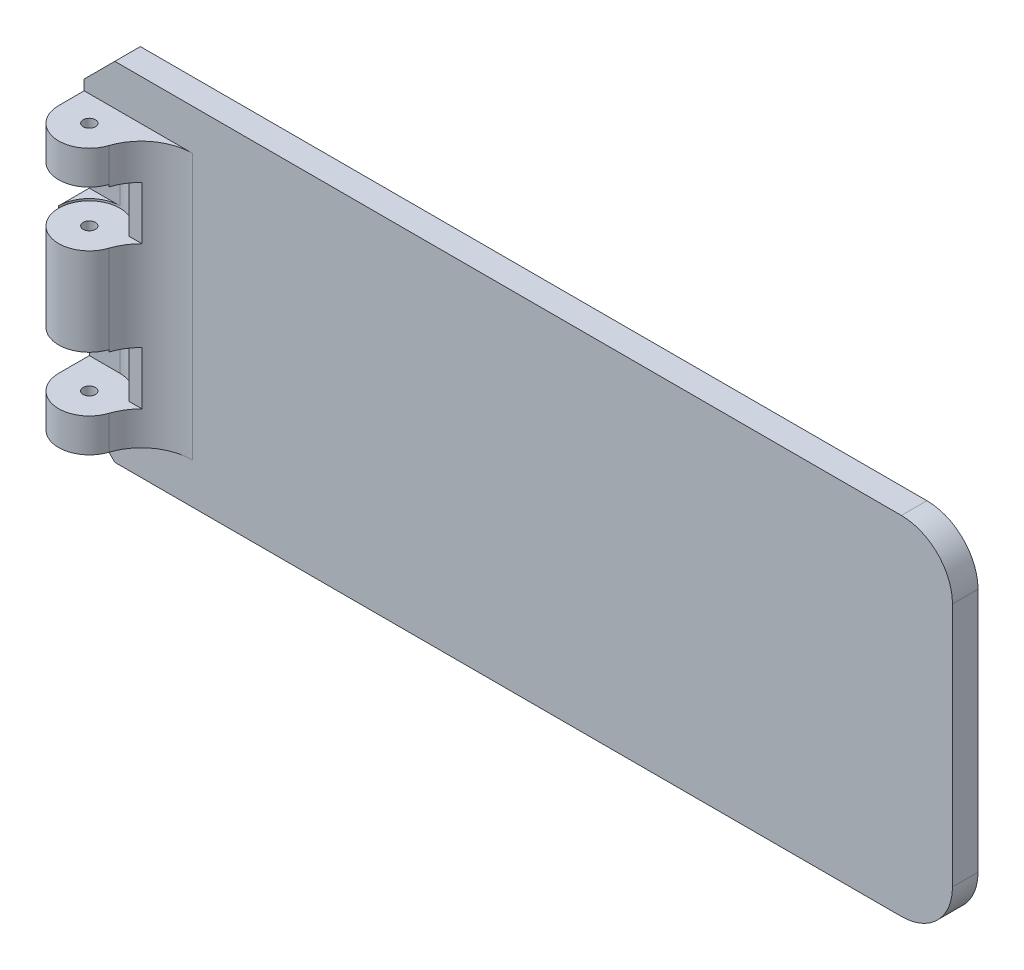
ISO-10303-21;
HEADER;
FILE_DESCRIPTION(('STEP AP214'),'2;1');
FILE_NAME('part.step','',(''),(''),'','','');
FILE_SCHEMA(('AUTOMOTIVE_DESIGN { 1 0 10303 214 1 1 1 1 }'));
ENDSEC;
DATA;
#1=APPLICATION_CONTEXT('core data for automotive mechanical design processes');
#2=APPLICATION_PROTOCOL_DEFINITION('international standard','automotive_design',2000,#1);
#3=PRODUCT_CONTEXT('',#1,'mechanical');
#4=PRODUCT('Part','Part','',(#3));
#5=PRODUCT_RELATED_PRODUCT_CATEGORY('part','',(#4));
#6=PRODUCT_DEFINITION_FORMATION('','',#4);
#7=PRODUCT_DEFINITION_CONTEXT('part definition',#1,'design');
#8=PRODUCT_DEFINITION('design','',#6,#7);
#9=PRODUCT_DEFINITION_SHAPE('','',#8);
#10=(LENGTH_UNIT() NAMED_UNIT(*) SI_UNIT(.MILLI.,.METRE.));
#11=(NAMED_UNIT(*) PLANE_ANGLE_UNIT() SI_UNIT($,.RADIAN.));
#12=(NAMED_UNIT(*) SI_UNIT($,.STERADIAN.) SOLID_ANGLE_UNIT());
#13=UNCERTAINTY_MEASURE_WITH_UNIT(LENGTH_MEASURE(1.E-05),#10,'distance_accuracy_value','');
#14=(GEOMETRIC_REPRESENTATION_CONTEXT(3) GLOBAL_UNCERTAINTY_ASSIGNED_CONTEXT((#13)) GLOBAL_UNIT_ASSIGNED_CONTEXT((#10,
#11,#12)) REPRESENTATION_CONTEXT('',''));
#15=CARTESIAN_POINT('',(0.,0.,0.));
#16=DIRECTION('',(0.,0.,1.));
#17=DIRECTION('',(1.,0.,0.));
#18=AXIS2_PLACEMENT_3D('',#15,#16,#17);
#19=CARTESIAN_POINT('',(3.,34.,5.));
#20=DIRECTION('',(0.,-1.,0.));
#21=DIRECTION('',(0.,0.,-1.));
#22=AXIS2_PLACEMENT_3D('',#19,#20,#21);
#23=CYLINDRICAL_SURFACE('',#22,3.);
#24=CARTESIAN_POINT('',(3.,4.,5.));
#25=DIRECTION('',(0.,-1.,0.));
#26=DIRECTION('',(0.,0.,-1.));
#27=AXIS2_PLACEMENT_3D('',#24,#25,#26);
#28=CIRCLE('',#27,3.);
#29=CARTESIAN_POINT('',(5.8497532787945,4.,5.9375));
#30=VERTEX_POINT('',#29);
#31=CARTESIAN_POINT('',(0.,4.,5.));
#32=VERTEX_POINT('',#31);
#33=EDGE_CURVE('E359',#30,#32,#28,.T.);
#34=ORIENTED_EDGE('',*,*,#33,.F.);
#35=DIRECTION('',(0.,-1.,0.));
#36=VECTOR('',#35,1.);
#37=CARTESIAN_POINT('',(5.8497532787945,34.,5.9375));
#38=LINE('',#37,#36);
#39=CARTESIAN_POINT('',(5.8497532787945,7.3,5.9375));
#40=VERTEX_POINT('',#39);
#41=EDGE_CURVE('E284',#30,#40,#38,.F.);
#42=ORIENTED_EDGE('',*,*,#41,.T.);
#43=CARTESIAN_POINT('',(3.,7.3,5.));
#44=DIRECTION('',(0.,1.,0.));
#45=DIRECTION('',(-1.,0.,0.));
#46=AXIS2_PLACEMENT_3D('',#43,#44,#45);
#47=CIRCLE('',#46,3.);
#48=CARTESIAN_POINT('',(0.,7.3,5.));
#49=VERTEX_POINT('',#48);
#50=EDGE_CURVE('E384',#49,#40,#47,.T.);
#51=ORIENTED_EDGE('',*,*,#50,.F.);
#52=DIRECTION('',(0.,-1.,0.));
#53=VECTOR('',#52,1.);
#54=CARTESIAN_POINT('',(0.,34.,5.));
#55=LINE('',#54,#53);
#56=EDGE_CURVE('E278',#49,#32,#55,.T.);
#57=ORIENTED_EDGE('',*,*,#56,.T.);
#58=EDGE_LOOP('',(#34,#42,#51,#57));
#59=FACE_BOUND('',#58,.T.);
#60=ADVANCED_FACE('F35',(#59),#23,.T.);
#61=CARTESIAN_POINT('',(3.,34.,5.));
#62=DIRECTION('',(0.,-1.,0.));
#63=DIRECTION('',(0.,0.,-1.));
#64=AXIS2_PLACEMENT_3D('',#61,#62,#63);
#65=CYLINDRICAL_SURFACE('',#64,0.6);
#66=CARTESIAN_POINT('',(3.,7.3,5.));
#67=DIRECTION('',(0.,1.,0.));
#68=DIRECTION('',(-1.,0.,0.));
#69=AXIS2_PLACEMENT_3D('',#66,#67,#68);
#70=CIRCLE('',#69,0.6);
#71=CARTESIAN_POINT('',(2.4,7.3,5.));
#72=VERTEX_POINT('',#71);
#73=EDGE_CURVE('E403',#72,#72,#70,.T.);
#74=ORIENTED_EDGE('',*,*,#73,.T.);
#75=EDGE_LOOP('',(#74));
#76=FACE_BOUND('',#75,.T.);
#77=CARTESIAN_POINT('',(3.,4.,5.));
#78=DIRECTION('',(0.,-1.,0.));
#79=DIRECTION('',(0.,0.,-1.));
#80=AXIS2_PLACEMENT_3D('',#77,#78,#79);
#81=CIRCLE('',#80,0.6);
#82=CARTESIAN_POINT('',(3.,4.,4.4));
#83=VERTEX_POINT('',#82);
#84=EDGE_CURVE('E364',#83,#83,#81,.T.);
#85=ORIENTED_EDGE('',*,*,#84,.T.);
#86=EDGE_LOOP('',(#85));
#87=FACE_BOUND('',#86,.T.);
#88=ADVANCED_FACE('F449',(#76,#87),#65,.F.);
#89=CARTESIAN_POINT('',(10.5993420767853,34.,7.5));
#90=DIRECTION('',(0.,-1.,0.));
#91=DIRECTION('',(0.,0.,-1.));
#92=AXIS2_PLACEMENT_3D('',#89,#90,#91);
#93=CYLINDRICAL_SURFACE('',#92,5.);
#94=CARTESIAN_POINT('',(5.8497532787945,26.5,5.9375));
#95=VERTEX_POINT('',#94);
#96=CARTESIAN_POINT('',(5.8497532787945,26.7,5.9375));
#97=VERTEX_POINT('',#96);
#98=EDGE_CURVE('E230',#95,#97,#38,.F.);
#99=ORIENTED_EDGE('',*,*,#98,.F.);
#100=CARTESIAN_POINT('',(10.5993420767853,26.5,7.5));
#101=DIRECTION('',(0.,1.,0.));
#102=DIRECTION('',(0.,0.,1.));
#103=AXIS2_PLACEMENT_3D('',#100,#101,#102);
#104=CIRCLE('',#103,5.);
#105=CARTESIAN_POINT('',(7.09098152661378,26.5,3.9375));
#106=VERTEX_POINT('',#105);
#107=EDGE_CURVE('E219',#95,#106,#104,.F.);
#108=ORIENTED_EDGE('',*,*,#107,.T.);
#109=DIRECTION('',(0.,-1.,0.));
#110=VECTOR('',#109,1.);
#111=CARTESIAN_POINT('',(7.09098152661378,34.,3.9375));
#112=LINE('',#111,#110);
#113=CARTESIAN_POINT('',(7.09098152661378,21.3,3.9375));
#114=VERTEX_POINT('',#113);
#115=EDGE_CURVE('E214',#106,#114,#112,.T.);
#116=ORIENTED_EDGE('',*,*,#115,.T.);
#117=CARTESIAN_POINT('',(10.5993420767853,21.3,7.5));
#118=DIRECTION('',(0.,-1.,0.));
#119=DIRECTION('',(0.,0.,-1.));
#120=AXIS2_PLACEMENT_3D('',#117,#118,#119);
#121=CIRCLE('',#120,5.);
#122=CARTESIAN_POINT('',(5.8497532787945,21.3,5.9375));
#123=VERTEX_POINT('',#122);
#124=EDGE_CURVE('E207',#114,#123,#121,.F.);
#125=ORIENTED_EDGE('',*,*,#124,.T.);
#126=CARTESIAN_POINT('',(5.8497532787945,12.7,5.9375));
#127=VERTEX_POINT('',#126);
#128=EDGE_CURVE('E212',#127,#123,#38,.F.);
#129=ORIENTED_EDGE('',*,*,#128,.F.);
#130=CARTESIAN_POINT('',(5.8497532787945,12.5,5.9375));
#131=VERTEX_POINT('',#130);
#132=EDGE_CURVE('E229',#131,#127,#38,.F.);
#133=ORIENTED_EDGE('',*,*,#132,.F.);
#134=CARTESIAN_POINT('',(10.5993420767853,12.5,7.5));
#135=DIRECTION('',(0.,1.,0.));
#136=DIRECTION('',(0.,0.,1.));
#137=AXIS2_PLACEMENT_3D('',#134,#135,#136);
#138=CIRCLE('',#137,5.);
#139=CARTESIAN_POINT('',(7.09098152661378,12.5,3.9375));
#140=VERTEX_POINT('',#139);
#141=EDGE_CURVE('E337',#131,#140,#138,.F.);
#142=ORIENTED_EDGE('',*,*,#141,.T.);
#143=DIRECTION('',(0.,-1.,0.));
#144=VECTOR('',#143,1.);
#145=CARTESIAN_POINT('',(7.09098152661378,34.,3.9375));
#146=LINE('',#145,#144);
#147=CARTESIAN_POINT('',(7.09098152661378,7.3,3.9375));
#148=VERTEX_POINT('',#147);
#149=EDGE_CURVE('E346',#140,#148,#146,.T.);
#150=ORIENTED_EDGE('',*,*,#149,.T.);
#151=CARTESIAN_POINT('',(10.5993420767853,7.3,7.5));
#152=DIRECTION('',(0.,-1.,0.));
#153=DIRECTION('',(0.,0.,-1.));
#154=AXIS2_PLACEMENT_3D('',#151,#152,#153);
#155=CIRCLE('',#154,5.);
#156=EDGE_CURVE('E349',#148,#40,#155,.F.);
#157=ORIENTED_EDGE('',*,*,#156,.T.);
#158=ORIENTED_EDGE('',*,*,#41,.F.);
#159=CARTESIAN_POINT('',(10.5993420767853,4.,7.5));
#160=DIRECTION('',(0.,-1.,0.));
#161=DIRECTION('',(0.,0.,-1.));
#162=AXIS2_PLACEMENT_3D('',#159,#160,#161);
#163=CIRCLE('',#162,5.);
#164=CARTESIAN_POINT('',(10.5993420767853,4.,2.5));
#165=VERTEX_POINT('',#164);
#166=EDGE_CURVE('E295',#165,#30,#163,.F.);
#167=ORIENTED_EDGE('',*,*,#166,.F.);
#168=DIRECTION('',(0.,1.,0.));
#169=VECTOR('',#168,1.);
#170=CARTESIAN_POINT('',(10.5993420767853,0.,2.5));
#171=LINE('',#170,#169);
#172=CARTESIAN_POINT('',(10.5993420767853,30.,2.5));
#173=VERTEX_POINT('',#172);
#174=EDGE_CURVE('E281',#173,#165,#171,.F.);
#175=ORIENTED_EDGE('',*,*,#174,.F.);
#176=CARTESIAN_POINT('',(10.5993420767853,30.,7.5));
#177=DIRECTION('',(0.,-1.,0.));
#178=DIRECTION('',(0.,0.,-1.));
#179=AXIS2_PLACEMENT_3D('',#176,#177,#178);
#180=CIRCLE('',#179,5.);
#181=CARTESIAN_POINT('',(5.8497532787945,30.,5.9375));
#182=VERTEX_POINT('',#181);
#183=EDGE_CURVE('E292',#173,#182,#180,.F.);
#184=ORIENTED_EDGE('',*,*,#183,.T.);
#185=EDGE_CURVE('E232',#97,#182,#38,.F.);
#186=ORIENTED_EDGE('',*,*,#185,.F.);
#187=EDGE_LOOP('',(#99,#108,#116,#125,#129,#133,#142,#150,#157,#158,#167,#175,#184,#186));
#188=FACE_BOUND('',#187,.T.);
#189=ADVANCED_FACE('F210',(#188),#93,.F.);
#190=CARTESIAN_POINT('',(0.,21.3,5.));
#191=VERTEX_POINT('',#190);
#192=CARTESIAN_POINT('',(0.,12.7,5.));
#193=VERTEX_POINT('',#192);
#194=EDGE_CURVE('E282',#191,#193,#55,.T.);
#195=ORIENTED_EDGE('',*,*,#194,.T.);
#196=CARTESIAN_POINT('',(3.,12.7,5.));
#197=DIRECTION('',(0.,1.,0.));
#198=DIRECTION('',(-1.,0.,0.));
#199=AXIS2_PLACEMENT_3D('',#196,#197,#198);
#200=CIRCLE('',#199,3.);
#201=EDGE_CURVE('E228',#193,#127,#200,.T.);
#202=ORIENTED_EDGE('',*,*,#201,.T.);
#203=ORIENTED_EDGE('',*,*,#128,.T.);
#204=CARTESIAN_POINT('',(3.,21.3,5.));
#205=DIRECTION('',(0.,1.,0.));
#206=DIRECTION('',(-1.,0.,0.));
#207=AXIS2_PLACEMENT_3D('',#204,#205,#206);
#208=CIRCLE('',#207,3.);
#209=EDGE_CURVE('E226',#191,#123,#208,.T.);
#210=ORIENTED_EDGE('',*,*,#209,.F.);
#211=EDGE_LOOP('',(#195,#202,#203,#210));
#212=FACE_BOUND('',#211,.T.);
#213=ADVANCED_FACE('F225',(#212),#23,.T.);
#214=CARTESIAN_POINT('',(3.,12.7,5.));
#215=DIRECTION('',(0.,1.,0.));
#216=DIRECTION('',(-1.,0.,0.));
#217=AXIS2_PLACEMENT_3D('',#214,#215,#216);
#218=CIRCLE('',#217,0.6);
#219=CARTESIAN_POINT('',(2.4,12.7,5.));
#220=VERTEX_POINT('',#219);
#221=EDGE_CURVE('E406',#220,#220,#218,.T.);
#222=ORIENTED_EDGE('',*,*,#221,.F.);
#223=EDGE_LOOP('',(#222));
#224=FACE_BOUND('',#223,.T.);
#225=CARTESIAN_POINT('',(3.,21.3,5.));
#226=DIRECTION('',(0.,1.,0.));
#227=DIRECTION('',(-1.,0.,0.));
#228=AXIS2_PLACEMENT_3D('',#225,#226,#227);
#229=CIRCLE('',#228,0.6);
#230=CARTESIAN_POINT('',(2.4,21.3,5.));
#231=VERTEX_POINT('',#230);
#232=EDGE_CURVE('E247',#231,#231,#229,.T.);
#233=ORIENTED_EDGE('',*,*,#232,.T.);
#234=EDGE_LOOP('',(#233));
#235=FACE_BOUND('',#234,.T.);
#236=ADVANCED_FACE('F458',(#224,#235),#65,.F.);
#237=CARTESIAN_POINT('',(0.,34.,0.));
#238=DIRECTION('',(1.,0.,0.));
#239=DIRECTION('',(0.,0.,-1.));
#240=AXIS2_PLACEMENT_3D('',#237,#238,#239);
#241=PLANE('',#240);
#242=DIRECTION('',(0.,1.,0.));
#243=VECTOR('',#242,1.);
#244=CARTESIAN_POINT('',(0.,34.,2.5));
#245=LINE('',#244,#243);
#246=CARTESIAN_POINT('',(0.,30.,2.5));
#247=VERTEX_POINT('',#246);
#248=CARTESIAN_POINT('',(0.,31.,2.5));
#249=VERTEX_POINT('',#248);
#250=EDGE_CURVE('E381',#247,#249,#245,.T.);
#251=ORIENTED_EDGE('',*,*,#250,.T.);
#252=DIRECTION('',(0.,0.,-1.));
#253=VECTOR('',#252,1.);
#254=CARTESIAN_POINT('',(0.,31.,0.));
#255=LINE('',#254,#253);
#256=CARTESIAN_POINT('',(0.,31.,0.));
#257=VERTEX_POINT('',#256);
#258=EDGE_CURVE('E307',#249,#257,#255,.T.);
#259=ORIENTED_EDGE('',*,*,#258,.T.);
#260=DIRECTION('',(0.,-1.,0.));
#261=VECTOR('',#260,1.);
#262=CARTESIAN_POINT('',(0.,34.,0.));
#263=LINE('',#262,#261);
#264=CARTESIAN_POINT('',(0.,3.,0.));
#265=VERTEX_POINT('',#264);
#266=EDGE_CURVE('E265',#257,#265,#263,.T.);
#267=ORIENTED_EDGE('',*,*,#266,.T.);
#268=DIRECTION('',(0.,0.,1.));
#269=VECTOR('',#268,1.);
#270=CARTESIAN_POINT('',(0.,3.,0.));
#271=LINE('',#270,#269);
#272=CARTESIAN_POINT('',(0.,3.,2.5));
#273=VERTEX_POINT('',#272);
#274=EDGE_CURVE('E304',#265,#273,#271,.T.);
#275=ORIENTED_EDGE('',*,*,#274,.T.);
#276=DIRECTION('',(0.,1.,0.));
#277=VECTOR('',#276,1.);
#278=CARTESIAN_POINT('',(0.,34.,2.5));
#279=LINE('',#278,#277);
#280=CARTESIAN_POINT('',(0.,4.,2.5));
#281=VERTEX_POINT('',#280);
#282=EDGE_CURVE('E367',#273,#281,#279,.T.);
#283=ORIENTED_EDGE('',*,*,#282,.T.);
#284=DIRECTION('',(0.,0.,-1.));
#285=VECTOR('',#284,1.);
#286=CARTESIAN_POINT('',(0.,4.,0.));
#287=LINE('',#286,#285);
#288=EDGE_CURVE('E361',#32,#281,#287,.T.);
#289=ORIENTED_EDGE('',*,*,#288,.F.);
#290=ORIENTED_EDGE('',*,*,#56,.F.);
#291=DIRECTION('',(0.,0.,1.));
#292=VECTOR('',#291,1.);
#293=CARTESIAN_POINT('',(0.,7.3,0.));
#294=LINE('',#293,#292);
#295=CARTESIAN_POINT('',(0.,7.3,2.));
#296=VERTEX_POINT('',#295);
#297=EDGE_CURVE('E390',#296,#49,#294,.T.);
#298=ORIENTED_EDGE('',*,*,#297,.F.);
#299=DIRECTION('',(0.,-1.,0.));
#300=VECTOR('',#299,1.);
#301=CARTESIAN_POINT('',(0.,12.7,2.));
#302=LINE('',#301,#300);
#303=CARTESIAN_POINT('',(0.,12.7,2.));
#304=VERTEX_POINT('',#303);
#305=EDGE_CURVE('E399',#304,#296,#302,.T.);
#306=ORIENTED_EDGE('',*,*,#305,.F.);
#307=DIRECTION('',(0.,0.,1.));
#308=VECTOR('',#307,1.);
#309=CARTESIAN_POINT('',(0.,12.7,0.));
#310=LINE('',#309,#308);
#311=EDGE_CURVE('E396',#304,#193,#310,.T.);
#312=ORIENTED_EDGE('',*,*,#311,.T.);
#313=ORIENTED_EDGE('',*,*,#194,.F.);
#314=DIRECTION('',(0.,-1.,0.));
#315=VECTOR('',#314,1.);
#316=CARTESIAN_POINT('',(0.,26.7,5.));
#317=LINE('',#316,#315);
#318=CARTESIAN_POINT('',(0.,21.5,5.));
#319=VERTEX_POINT('',#318);
#320=EDGE_CURVE('E254',#191,#319,#317,.F.);
#321=ORIENTED_EDGE('',*,*,#320,.T.);
#322=DIRECTION('',(0.,0.,1.));
#323=VECTOR('',#322,1.);
#324=CARTESIAN_POINT('',(0.,21.5,0.));
#325=LINE('',#324,#323);
#326=CARTESIAN_POINT('',(0.,21.5,2.));
#327=VERTEX_POINT('',#326);
#328=EDGE_CURVE('E418',#327,#319,#325,.T.);
#329=ORIENTED_EDGE('',*,*,#328,.F.);
#330=DIRECTION('',(0.,-1.,0.));
#331=VECTOR('',#330,1.);
#332=CARTESIAN_POINT('',(0.,34.,2.));
#333=LINE('',#332,#331);
#334=CARTESIAN_POINT('',(0.,26.5,2.));
#335=VERTEX_POINT('',#334);
#336=EDGE_CURVE('E242',#335,#327,#333,.T.);
#337=ORIENTED_EDGE('',*,*,#336,.F.);
#338=DIRECTION('',(0.,0.,1.));
#339=VECTOR('',#338,1.);
#340=CARTESIAN_POINT('',(0.,26.5,0.));
#341=LINE('',#340,#339);
#342=CARTESIAN_POINT('',(0.,26.5,5.));
#343=VERTEX_POINT('',#342);
#344=EDGE_CURVE('E419',#335,#343,#341,.T.);
#345=ORIENTED_EDGE('',*,*,#344,.T.);
#346=CARTESIAN_POINT('',(0.,26.7,5.));
#347=VERTEX_POINT('',#346);
#348=EDGE_CURVE('E253',#343,#347,#317,.F.);
#349=ORIENTED_EDGE('',*,*,#348,.T.);
#350=CARTESIAN_POINT('',(0.,30.,5.));
#351=VERTEX_POINT('',#350);
#352=EDGE_CURVE('E279',#351,#347,#55,.T.);
#353=ORIENTED_EDGE('',*,*,#352,.F.);
#354=DIRECTION('',(0.,0.,-1.));
#355=VECTOR('',#354,1.);
#356=CARTESIAN_POINT('',(0.,30.,0.));
#357=LINE('',#356,#355);
#358=EDGE_CURVE('E375',#351,#247,#357,.T.);
#359=ORIENTED_EDGE('',*,*,#358,.T.);
#360=EDGE_LOOP('',(#251,#259,#267,#275,#283,#289,#290,#298,#306,#312,#313,#321,#329,#337,#345,
#349,#353,#359));
#361=FACE_BOUND('',#360,.T.);
#362=ADVANCED_FACE('F432',(#361),#241,.F.);
#363=ORIENTED_EDGE('',*,*,#185,.T.);
#364=CARTESIAN_POINT('',(3.,30.,5.));
#365=DIRECTION('',(0.,-1.,0.));
#366=DIRECTION('',(0.,0.,-1.));
#367=AXIS2_PLACEMENT_3D('',#364,#365,#366);
#368=CIRCLE('',#367,3.);
#369=EDGE_CURVE('E372',#182,#351,#368,.T.);
#370=ORIENTED_EDGE('',*,*,#369,.T.);
#371=ORIENTED_EDGE('',*,*,#352,.T.);
#372=CARTESIAN_POINT('',(3.,26.7,5.));
#373=DIRECTION('',(0.,1.,0.));
#374=DIRECTION('',(-1.,0.,0.));
#375=AXIS2_PLACEMENT_3D('',#372,#373,#374);
#376=CIRCLE('',#375,3.);
#377=EDGE_CURVE('E240',#347,#97,#376,.T.);
#378=ORIENTED_EDGE('',*,*,#377,.T.);
#379=EDGE_LOOP('',(#363,#370,#371,#378));
#380=FACE_BOUND('',#379,.T.);
#381=ADVANCED_FACE('F452',(#380),#23,.T.);
#382=CARTESIAN_POINT('',(0.,34.,2.5));
#383=DIRECTION('',(0.,0.,-1.));
#384=DIRECTION('',(-1.,0.,0.));
#385=AXIS2_PLACEMENT_3D('',#382,#383,#384);
#386=PLANE('',#385);
#387=DIRECTION('',(1.,0.,0.));
#388=VECTOR('',#387,1.);
#389=CARTESIAN_POINT('',(0.,0.,2.5));
#390=LINE('',#389,#388);
#391=CARTESIAN_POINT('',(3.00000000000002,0.,2.5));
#392=VERTEX_POINT('',#391);
#393=CARTESIAN_POINT('',(80.,0.,2.5));
#394=VERTEX_POINT('',#393);
#395=EDGE_CURVE('E257',#392,#394,#390,.T.);
#396=ORIENTED_EDGE('',*,*,#395,.T.);
#397=CARTESIAN_POINT('',(80.,5.,2.5));
#398=DIRECTION('',(0.,0.,-1.));
#399=DIRECTION('',(-1.,0.,0.));
#400=AXIS2_PLACEMENT_3D('',#397,#398,#399);
#401=CIRCLE('',#400,5.);
#402=CARTESIAN_POINT('',(85.,5.,2.5));
#403=VERTEX_POINT('',#402);
#404=EDGE_CURVE('E320',#394,#403,#401,.F.);
#405=ORIENTED_EDGE('',*,*,#404,.T.);
#406=DIRECTION('',(0.,-1.,0.));
#407=VECTOR('',#406,1.);
#408=CARTESIAN_POINT('',(85.,34.,2.5));
#409=LINE('',#408,#407);
#410=CARTESIAN_POINT('',(85.,29.,2.5));
#411=VERTEX_POINT('',#410);
#412=EDGE_CURVE('E275',#411,#403,#409,.T.);
#413=ORIENTED_EDGE('',*,*,#412,.F.);
#414=CARTESIAN_POINT('',(80.,29.,2.5));
#415=DIRECTION('',(0.,0.,-1.));
#416=DIRECTION('',(-1.,0.,0.));
#417=AXIS2_PLACEMENT_3D('',#414,#415,#416);
#418=CIRCLE('',#417,5.);
#419=CARTESIAN_POINT('',(80.,34.,2.5));
#420=VERTEX_POINT('',#419);
#421=EDGE_CURVE('E318',#411,#420,#418,.F.);
#422=ORIENTED_EDGE('',*,*,#421,.T.);
#423=DIRECTION('',(1.,0.,0.));
#424=VECTOR('',#423,1.);
#425=CARTESIAN_POINT('',(0.,34.,2.5));
#426=LINE('',#425,#424);
#427=CARTESIAN_POINT('',(3.,34.,2.5));
#428=VERTEX_POINT('',#427);
#429=EDGE_CURVE('E258',#428,#420,#426,.T.);
#430=ORIENTED_EDGE('',*,*,#429,.F.);
#431=DIRECTION('',(-0.707106781186546,-0.707106781186549,0.));
#432=VECTOR('',#431,1.);
#433=CARTESIAN_POINT('',(3.,34.,2.5));
#434=LINE('',#433,#432);
#435=EDGE_CURVE('E302',#428,#249,#434,.T.);
#436=ORIENTED_EDGE('',*,*,#435,.T.);
#437=ORIENTED_EDGE('',*,*,#250,.F.);
#438=DIRECTION('',(-1.,0.,0.));
#439=VECTOR('',#438,1.);
#440=CARTESIAN_POINT('',(14.8947088024145,30.,2.5));
#441=LINE('',#440,#439);
#442=EDGE_CURVE('E369',#173,#247,#441,.T.);
#443=ORIENTED_EDGE('',*,*,#442,.F.);
#444=ORIENTED_EDGE('',*,*,#174,.T.);
#445=DIRECTION('',(1.,0.,0.));
#446=VECTOR('',#445,1.);
#447=CARTESIAN_POINT('',(14.4692724215992,4.,2.5));
#448=LINE('',#447,#446);
#449=EDGE_CURVE('E357',#281,#165,#448,.T.);
#450=ORIENTED_EDGE('',*,*,#449,.F.);
#451=ORIENTED_EDGE('',*,*,#282,.F.);
#452=DIRECTION('',(-0.707106781186549,0.707106781186546,0.));
#453=VECTOR('',#452,1.);
#454=CARTESIAN_POINT('',(0.,3.,2.5));
#455=LINE('',#454,#453);
#456=EDGE_CURVE('E300',#273,#392,#455,.F.);
#457=ORIENTED_EDGE('',*,*,#456,.T.);
#458=EDGE_LOOP('',(#396,#405,#413,#422,#430,#436,#437,#443,#444,#450,#451,#457));
#459=FACE_BOUND('',#458,.T.);
#460=ADVANCED_FACE('F465',(#459),#386,.F.);
#461=CARTESIAN_POINT('',(85.,34.,0.));
#462=DIRECTION('',(1.,0.,0.));
#463=DIRECTION('',(0.,0.,-1.));
#464=AXIS2_PLACEMENT_3D('',#461,#462,#463);
#465=PLANE('',#464);
#466=ORIENTED_EDGE('',*,*,#412,.T.);
#467=DIRECTION('',(0.,0.,1.));
#468=VECTOR('',#467,1.);
#469=CARTESIAN_POINT('',(85.,5.,0.));
#470=LINE('',#469,#468);
#471=CARTESIAN_POINT('',(85.,5.,0.));
#472=VERTEX_POINT('',#471);
#473=EDGE_CURVE('E325',#403,#472,#470,.F.);
#474=ORIENTED_EDGE('',*,*,#473,.T.);
#475=DIRECTION('',(0.,-1.,0.));
#476=VECTOR('',#475,1.);
#477=CARTESIAN_POINT('',(85.,34.,0.));
#478=LINE('',#477,#476);
#479=CARTESIAN_POINT('',(85.,29.,0.));
#480=VERTEX_POINT('',#479);
#481=EDGE_CURVE('E272',#480,#472,#478,.T.);
#482=ORIENTED_EDGE('',*,*,#481,.F.);
#483=DIRECTION('',(0.,0.,1.));
#484=VECTOR('',#483,1.);
#485=CARTESIAN_POINT('',(85.,29.,0.));
#486=LINE('',#485,#484);
#487=EDGE_CURVE('E322',#480,#411,#486,.T.);
#488=ORIENTED_EDGE('',*,*,#487,.T.);
#489=EDGE_LOOP('',(#466,#474,#482,#488));
#490=FACE_BOUND('',#489,.T.);
#491=ADVANCED_FACE('F471',(#490),#465,.T.);
#492=CARTESIAN_POINT('',(0.,34.,0.));
#493=DIRECTION('',(0.,0.,-1.));
#494=DIRECTION('',(-1.,0.,0.));
#495=AXIS2_PLACEMENT_3D('',#492,#493,#494);
#496=PLANE('',#495);
#497=ORIENTED_EDGE('',*,*,#481,.T.);
#498=CARTESIAN_POINT('',(80.,5.,0.));
#499=DIRECTION('',(0.,0.,-1.));
#500=DIRECTION('',(-1.,0.,0.));
#501=AXIS2_PLACEMENT_3D('',#498,#499,#500);
#502=CIRCLE('',#501,5.);
#503=CARTESIAN_POINT('',(80.,0.,0.));
#504=VERTEX_POINT('',#503);
#505=EDGE_CURVE('E329',#472,#504,#502,.T.);
#506=ORIENTED_EDGE('',*,*,#505,.T.);
#507=DIRECTION('',(1.,0.,0.));
#508=VECTOR('',#507,1.);
#509=CARTESIAN_POINT('',(0.,0.,0.));
#510=LINE('',#509,#508);
#511=CARTESIAN_POINT('',(3.00000000000002,0.,0.));
#512=VERTEX_POINT('',#511);
#513=EDGE_CURVE('E262',#512,#504,#510,.T.);
#514=ORIENTED_EDGE('',*,*,#513,.F.);
#515=DIRECTION('',(0.707106781186549,-0.707106781186546,0.));
#516=VECTOR('',#515,1.);
#517=CARTESIAN_POINT('',(-15.5,18.4999999999999,0.));
#518=LINE('',#517,#516);
#519=EDGE_CURVE('E309',#512,#265,#518,.F.);
#520=ORIENTED_EDGE('',*,*,#519,.T.);
#521=ORIENTED_EDGE('',*,*,#266,.F.);
#522=DIRECTION('',(0.707106781186546,0.707106781186549,0.));
#523=VECTOR('',#522,1.);
#524=CARTESIAN_POINT('',(1.50000000000001,32.5,0.));
#525=LINE('',#524,#523);
#526=CARTESIAN_POINT('',(3.,34.,0.));
#527=VERTEX_POINT('',#526);
#528=EDGE_CURVE('E311',#257,#527,#525,.T.);
#529=ORIENTED_EDGE('',*,*,#528,.T.);
#530=DIRECTION('',(1.,0.,0.));
#531=VECTOR('',#530,1.);
#532=CARTESIAN_POINT('',(0.,34.,0.));
#533=LINE('',#532,#531);
#534=CARTESIAN_POINT('',(80.,34.,0.));
#535=VERTEX_POINT('',#534);
#536=EDGE_CURVE('E261',#527,#535,#533,.T.);
#537=ORIENTED_EDGE('',*,*,#536,.T.);
#538=CARTESIAN_POINT('',(80.,29.,0.));
#539=DIRECTION('',(0.,0.,-1.));
#540=DIRECTION('',(-1.,0.,0.));
#541=AXIS2_PLACEMENT_3D('',#538,#539,#540);
#542=CIRCLE('',#541,5.);
#543=EDGE_CURVE('E327',#535,#480,#542,.T.);
#544=ORIENTED_EDGE('',*,*,#543,.T.);
#545=EDGE_LOOP('',(#497,#506,#514,#520,#521,#529,#537,#544));
#546=FACE_BOUND('',#545,.T.);
#547=ADVANCED_FACE('F742',(#546),#496,.T.);
#548=CARTESIAN_POINT('',(3.,30.,5.));
#549=DIRECTION('',(0.,-1.,0.));
#550=DIRECTION('',(0.,0.,-1.));
#551=AXIS2_PLACEMENT_3D('',#548,#549,#550);
#552=CIRCLE('',#551,0.6);
#553=CARTESIAN_POINT('',(3.,30.,4.4));
#554=VERTEX_POINT('',#553);
#555=EDGE_CURVE('E378',#554,#554,#552,.T.);
#556=ORIENTED_EDGE('',*,*,#555,.F.);
#557=EDGE_LOOP('',(#556));
#558=FACE_BOUND('',#557,.T.);
#559=CARTESIAN_POINT('',(3.,26.7,5.));
#560=DIRECTION('',(0.,1.,0.));
#561=DIRECTION('',(-1.,0.,0.));
#562=AXIS2_PLACEMENT_3D('',#559,#560,#561);
#563=CIRCLE('',#562,0.6);
#564=CARTESIAN_POINT('',(2.4,26.7,5.));
#565=VERTEX_POINT('',#564);
#566=EDGE_CURVE('E250',#565,#565,#563,.T.);
#567=ORIENTED_EDGE('',*,*,#566,.F.);
#568=EDGE_LOOP('',(#567));
#569=FACE_BOUND('',#568,.T.);
#570=ADVANCED_FACE('F459',(#558,#569),#65,.F.);
#571=CARTESIAN_POINT('',(0.,34.,0.));
#572=DIRECTION('',(0.,1.,0.));
#573=DIRECTION('',(0.,0.,1.));
#574=AXIS2_PLACEMENT_3D('',#571,#572,#573);
#575=PLANE('',#574);
#576=ORIENTED_EDGE('',*,*,#429,.T.);
#577=DIRECTION('',(0.,0.,1.));
#578=VECTOR('',#577,1.);
#579=CARTESIAN_POINT('',(80.,34.,0.));
#580=LINE('',#579,#578);
#581=EDGE_CURVE('E331',#420,#535,#580,.F.);
#582=ORIENTED_EDGE('',*,*,#581,.T.);
#583=ORIENTED_EDGE('',*,*,#536,.F.);
#584=DIRECTION('',(0.,0.,1.));
#585=VECTOR('',#584,1.);
#586=CARTESIAN_POINT('',(3.,34.,2.5));
#587=LINE('',#586,#585);
#588=EDGE_CURVE('E297',#527,#428,#587,.T.);
#589=ORIENTED_EDGE('',*,*,#588,.T.);
#590=EDGE_LOOP('',(#576,#582,#583,#589));
#591=FACE_BOUND('',#590,.T.);
#592=ADVANCED_FACE('F736',(#591),#575,.T.);
#593=CARTESIAN_POINT('',(0.,0.,0.));
#594=DIRECTION('',(0.,1.,0.));
#595=DIRECTION('',(0.,0.,1.));
#596=AXIS2_PLACEMENT_3D('',#593,#594,#595);
#597=PLANE('',#596);
#598=ORIENTED_EDGE('',*,*,#513,.T.);
#599=DIRECTION('',(0.,0.,1.));
#600=VECTOR('',#599,1.);
#601=CARTESIAN_POINT('',(80.,0.,2.5));
#602=LINE('',#601,#600);
#603=EDGE_CURVE('E315',#504,#394,#602,.T.);
#604=ORIENTED_EDGE('',*,*,#603,.T.);
#605=ORIENTED_EDGE('',*,*,#395,.F.);
#606=DIRECTION('',(0.,0.,-1.));
#607=VECTOR('',#606,1.);
#608=CARTESIAN_POINT('',(3.00000000000002,0.,0.));
#609=LINE('',#608,#607);
#610=EDGE_CURVE('E313',#392,#512,#609,.T.);
#611=ORIENTED_EDGE('',*,*,#610,.T.);
#612=EDGE_LOOP('',(#598,#604,#605,#611));
#613=FACE_BOUND('',#612,.T.);
#614=ADVANCED_FACE('F693',(#613),#597,.F.);
#615=CARTESIAN_POINT('',(3.,26.7,5.));
#616=DIRECTION('',(0.,-1.,0.));
#617=DIRECTION('',(1.,0.,0.));
#618=AXIS2_PLACEMENT_3D('',#615,#616,#617);
#619=CYLINDRICAL_SURFACE('',#618,3.);
#620=CARTESIAN_POINT('',(3.,26.5,5.));
#621=DIRECTION('',(0.,1.,0.));
#622=DIRECTION('',(0.,0.,1.));
#623=AXIS2_PLACEMENT_3D('',#620,#621,#622);
#624=CIRCLE('',#623,3.);
#625=CARTESIAN_POINT('',(5.80554696093293,26.5,3.9375));
#626=VERTEX_POINT('',#625);
#627=EDGE_CURVE('E11',#95,#626,#624,.T.);
#628=ORIENTED_EDGE('',*,*,#627,.F.);
#629=ORIENTED_EDGE('',*,*,#98,.T.);
#630=EDGE_CURVE('E237',#97,#347,#376,.T.);
#631=ORIENTED_EDGE('',*,*,#630,.T.);
#632=ORIENTED_EDGE('',*,*,#348,.F.);
#633=CARTESIAN_POINT('',(3.,26.5,5.));
#634=DIRECTION('',(0.,1.,0.));
#635=DIRECTION('',(0.,0.,1.));
#636=AXIS2_PLACEMENT_3D('',#633,#634,#635);
#637=CIRCLE('',#636,3.);
#638=CARTESIAN_POINT('',(2.99999999999999,26.5,2.));
#639=VERTEX_POINT('',#638);
#640=EDGE_CURVE('E290',#639,#343,#637,.T.);
#641=ORIENTED_EDGE('',*,*,#640,.F.);
#642=DIRECTION('',(0.,-1.,0.));
#643=VECTOR('',#642,1.);
#644=CARTESIAN_POINT('',(2.99999999999999,26.5,2.));
#645=LINE('',#644,#643);
#646=CARTESIAN_POINT('',(2.99999999999999,21.5,2.));
#647=VERTEX_POINT('',#646);
#648=EDGE_CURVE('E415',#639,#647,#645,.T.);
#649=ORIENTED_EDGE('',*,*,#648,.T.);
#650=CARTESIAN_POINT('',(3.,21.5,5.));
#651=DIRECTION('',(0.,1.,0.));
#652=DIRECTION('',(0.,0.,1.));
#653=AXIS2_PLACEMENT_3D('',#650,#651,#652);
#654=CIRCLE('',#653,3.);
#655=EDGE_CURVE('E287',#647,#319,#654,.T.);
#656=ORIENTED_EDGE('',*,*,#655,.T.);
#657=ORIENTED_EDGE('',*,*,#320,.F.);
#658=CARTESIAN_POINT('',(5.80554696093293,21.3,3.9375));
#659=VERTEX_POINT('',#658);
#660=EDGE_CURVE('E235',#659,#191,#208,.T.);
#661=ORIENTED_EDGE('',*,*,#660,.F.);
#662=DIRECTION('',(0.,-1.,0.));
#663=VECTOR('',#662,1.);
#664=CARTESIAN_POINT('',(5.80554696093293,26.7,3.9375));
#665=LINE('',#664,#663);
#666=EDGE_CURVE('E500',#626,#659,#665,.T.);
#667=ORIENTED_EDGE('',*,*,#666,.F.);
#668=EDGE_LOOP('',(#628,#629,#631,#632,#641,#649,#656,#657,#661,#667));
#669=FACE_BOUND('',#668,.T.);
#670=ADVANCED_FACE('F435',(#669),#619,.F.);
#671=CARTESIAN_POINT('',(3.,26.7,5.));
#672=DIRECTION('',(0.,1.,0.));
#673=DIRECTION('',(-1.,0.,0.));
#674=AXIS2_PLACEMENT_3D('',#671,#672,#673);
#675=PLANE('',#674);
#676=ORIENTED_EDGE('',*,*,#566,.T.);
#677=EDGE_LOOP('',(#676));
#678=FACE_BOUND('',#677,.T.);
#679=ORIENTED_EDGE('',*,*,#377,.F.);
#680=ORIENTED_EDGE('',*,*,#630,.F.);
#681=EDGE_LOOP('',(#679,#680));
#682=FACE_BOUND('',#681,.T.);
#683=ADVANCED_FACE('F629',(#678,#682),#675,.F.);
#684=CARTESIAN_POINT('',(3.,21.3,5.));
#685=DIRECTION('',(0.,1.,0.));
#686=DIRECTION('',(-1.,0.,0.));
#687=AXIS2_PLACEMENT_3D('',#684,#685,#686);
#688=PLANE('',#687);
#689=ORIENTED_EDGE('',*,*,#232,.F.);
#690=EDGE_LOOP('',(#689));
#691=FACE_BOUND('',#690,.T.);
#692=ORIENTED_EDGE('',*,*,#209,.T.);
#693=ORIENTED_EDGE('',*,*,#124,.F.);
#694=DIRECTION('',(1.,0.,0.));
#695=VECTOR('',#694,1.);
#696=CARTESIAN_POINT('',(2.99999999999999,21.3,3.9375));
#697=LINE('',#696,#695);
#698=EDGE_CURVE('E503',#659,#114,#697,.T.);
#699=ORIENTED_EDGE('',*,*,#698,.F.);
#700=ORIENTED_EDGE('',*,*,#660,.T.);
#701=EDGE_LOOP('',(#692,#693,#699,#700));
#702=FACE_BOUND('',#701,.T.);
#703=ADVANCED_FACE('F233',(#691,#702),#688,.T.);
#704=CARTESIAN_POINT('',(2.99999999999999,26.5,2.));
#705=DIRECTION('',(0.,0.,1.));
#706=DIRECTION('',(1.,0.,0.));
#707=AXIS2_PLACEMENT_3D('',#704,#705,#706);
#708=PLANE('',#707);
#709=ORIENTED_EDGE('',*,*,#336,.T.);
#710=DIRECTION('',(-1.,0.,0.));
#711=VECTOR('',#710,1.);
#712=CARTESIAN_POINT('',(2.99999999999999,21.5,2.));
#713=LINE('',#712,#711);
#714=EDGE_CURVE('E409',#647,#327,#713,.T.);
#715=ORIENTED_EDGE('',*,*,#714,.F.);
#716=ORIENTED_EDGE('',*,*,#648,.F.);
#717=DIRECTION('',(-1.,0.,0.));
#718=VECTOR('',#717,1.);
#719=CARTESIAN_POINT('',(2.99999999999999,26.5,2.));
#720=LINE('',#719,#718);
#721=EDGE_CURVE('E412',#639,#335,#720,.T.);
#722=ORIENTED_EDGE('',*,*,#721,.T.);
#723=EDGE_LOOP('',(#709,#715,#716,#722));
#724=FACE_BOUND('',#723,.T.);
#725=ADVANCED_FACE('F427',(#724),#708,.T.);
#726=CARTESIAN_POINT('',(0.,26.5,0.));
#727=DIRECTION('',(0.,1.,0.));
#728=DIRECTION('',(0.,0.,1.));
#729=AXIS2_PLACEMENT_3D('',#726,#727,#728);
#730=PLANE('',#729);
#731=ORIENTED_EDGE('',*,*,#721,.F.);
#732=ORIENTED_EDGE('',*,*,#640,.T.);
#733=ORIENTED_EDGE('',*,*,#344,.F.);
#734=EDGE_LOOP('',(#731,#732,#733));
#735=FACE_BOUND('',#734,.T.);
#736=ADVANCED_FACE('F439',(#735),#730,.F.);
#737=CARTESIAN_POINT('',(0.,21.5,0.));
#738=DIRECTION('',(0.,1.,0.));
#739=DIRECTION('',(0.,0.,1.));
#740=AXIS2_PLACEMENT_3D('',#737,#738,#739);
#741=PLANE('',#740);
#742=ORIENTED_EDGE('',*,*,#328,.T.);
#743=ORIENTED_EDGE('',*,*,#655,.F.);
#744=ORIENTED_EDGE('',*,*,#714,.T.);
#745=EDGE_LOOP('',(#742,#743,#744));
#746=FACE_BOUND('',#745,.T.);
#747=ADVANCED_FACE('F431',(#746),#741,.T.);
#748=CARTESIAN_POINT('',(3.,12.7,5.));
#749=DIRECTION('',(0.,-1.,0.));
#750=DIRECTION('',(1.,0.,0.));
#751=AXIS2_PLACEMENT_3D('',#748,#749,#750);
#752=CYLINDRICAL_SURFACE('',#751,3.);
#753=CARTESIAN_POINT('',(3.,12.5,5.));
#754=DIRECTION('',(0.,1.,0.));
#755=DIRECTION('',(0.,0.,1.));
#756=AXIS2_PLACEMENT_3D('',#753,#754,#755);
#757=CIRCLE('',#756,3.);
#758=CARTESIAN_POINT('',(5.80554696093294,12.5,3.9375));
#759=VERTEX_POINT('',#758);
#760=EDGE_CURVE('E43',#131,#759,#757,.T.);
#761=ORIENTED_EDGE('',*,*,#760,.F.);
#762=ORIENTED_EDGE('',*,*,#132,.T.);
#763=CARTESIAN_POINT('',(3.,12.7,2.));
#764=VERTEX_POINT('',#763);
#765=EDGE_CURVE('E392',#127,#764,#200,.T.);
#766=ORIENTED_EDGE('',*,*,#765,.T.);
#767=DIRECTION('',(0.,-1.,0.));
#768=VECTOR('',#767,1.);
#769=CARTESIAN_POINT('',(3.,12.7,2.));
#770=LINE('',#769,#768);
#771=CARTESIAN_POINT('',(3.,7.3,2.));
#772=VERTEX_POINT('',#771);
#773=EDGE_CURVE('E401',#764,#772,#770,.T.);
#774=ORIENTED_EDGE('',*,*,#773,.T.);
#775=CARTESIAN_POINT('',(5.80554696093293,7.3,3.9375));
#776=VERTEX_POINT('',#775);
#777=EDGE_CURVE('E343',#776,#772,#47,.T.);
#778=ORIENTED_EDGE('',*,*,#777,.F.);
#779=DIRECTION('',(0.,-1.,0.));
#780=VECTOR('',#779,1.);
#781=CARTESIAN_POINT('',(5.80554696093294,12.7,3.9375));
#782=LINE('',#781,#780);
#783=EDGE_CURVE('E340',#759,#776,#782,.T.);
#784=ORIENTED_EDGE('',*,*,#783,.F.);
#785=EDGE_LOOP('',(#761,#762,#766,#774,#778,#784));
#786=FACE_BOUND('',#785,.T.);
#787=ADVANCED_FACE('F341',(#786),#752,.F.);
#788=CARTESIAN_POINT('',(0.,12.7,2.));
#789=DIRECTION('',(0.,0.,1.));
#790=DIRECTION('',(1.,0.,0.));
#791=AXIS2_PLACEMENT_3D('',#788,#789,#790);
#792=PLANE('',#791);
#793=ORIENTED_EDGE('',*,*,#773,.F.);
#794=DIRECTION('',(-1.,0.,0.));
#795=VECTOR('',#794,1.);
#796=CARTESIAN_POINT('',(0.,12.7,2.));
#797=LINE('',#796,#795);
#798=EDGE_CURVE('E394',#764,#304,#797,.T.);
#799=ORIENTED_EDGE('',*,*,#798,.T.);
#800=ORIENTED_EDGE('',*,*,#305,.T.);
#801=DIRECTION('',(-1.,0.,0.));
#802=VECTOR('',#801,1.);
#803=CARTESIAN_POINT('',(0.,7.3,2.));
#804=LINE('',#803,#802);
#805=EDGE_CURVE('E387',#772,#296,#804,.T.);
#806=ORIENTED_EDGE('',*,*,#805,.F.);
#807=EDGE_LOOP('',(#793,#799,#800,#806));
#808=FACE_BOUND('',#807,.T.);
#809=ADVANCED_FACE('F487',(#808),#792,.T.);
#810=CARTESIAN_POINT('',(0.,12.7,0.));
#811=DIRECTION('',(0.,1.,0.));
#812=DIRECTION('',(-1.,0.,0.));
#813=AXIS2_PLACEMENT_3D('',#810,#811,#812);
#814=PLANE('',#813);
#815=ORIENTED_EDGE('',*,*,#221,.T.);
#816=EDGE_LOOP('',(#815));
#817=FACE_BOUND('',#816,.T.);
#818=ORIENTED_EDGE('',*,*,#201,.F.);
#819=ORIENTED_EDGE('',*,*,#311,.F.);
#820=ORIENTED_EDGE('',*,*,#798,.F.);
#821=ORIENTED_EDGE('',*,*,#765,.F.);
#822=EDGE_LOOP('',(#818,#819,#820,#821));
#823=FACE_BOUND('',#822,.T.);
#824=ADVANCED_FACE('F481',(#817,#823),#814,.F.);
#825=CARTESIAN_POINT('',(0.,7.3,0.));
#826=DIRECTION('',(0.,1.,0.));
#827=DIRECTION('',(-1.,0.,0.));
#828=AXIS2_PLACEMENT_3D('',#825,#826,#827);
#829=PLANE('',#828);
#830=ORIENTED_EDGE('',*,*,#73,.F.);
#831=EDGE_LOOP('',(#830));
#832=FACE_BOUND('',#831,.T.);
#833=ORIENTED_EDGE('',*,*,#50,.T.);
#834=ORIENTED_EDGE('',*,*,#156,.F.);
#835=DIRECTION('',(1.,0.,0.));
#836=VECTOR('',#835,1.);
#837=CARTESIAN_POINT('',(3.4675345910368,7.3,3.9375));
#838=LINE('',#837,#836);
#839=EDGE_CURVE('E351',#776,#148,#838,.T.);
#840=ORIENTED_EDGE('',*,*,#839,.F.);
#841=ORIENTED_EDGE('',*,*,#777,.T.);
#842=ORIENTED_EDGE('',*,*,#805,.T.);
#843=ORIENTED_EDGE('',*,*,#297,.T.);
#844=EDGE_LOOP('',(#833,#834,#840,#841,#842,#843));
#845=FACE_BOUND('',#844,.T.);
#846=ADVANCED_FACE('F490',(#832,#845),#829,.T.);
#847=CARTESIAN_POINT('',(0.,30.,0.));
#848=DIRECTION('',(0.,-1.,0.));
#849=DIRECTION('',(0.,0.,-1.));
#850=AXIS2_PLACEMENT_3D('',#847,#848,#849);
#851=PLANE('',#850);
#852=ORIENTED_EDGE('',*,*,#555,.T.);
#853=EDGE_LOOP('',(#852));
#854=FACE_BOUND('',#853,.T.);
#855=ORIENTED_EDGE('',*,*,#369,.F.);
#856=ORIENTED_EDGE('',*,*,#183,.F.);
#857=ORIENTED_EDGE('',*,*,#442,.T.);
#858=ORIENTED_EDGE('',*,*,#358,.F.);
#859=EDGE_LOOP('',(#855,#856,#857,#858));
#860=FACE_BOUND('',#859,.T.);
#861=ADVANCED_FACE('F522',(#854,#860),#851,.F.);
#862=CARTESIAN_POINT('',(0.,4.,0.));
#863=DIRECTION('',(0.,-1.,0.));
#864=DIRECTION('',(0.,0.,-1.));
#865=AXIS2_PLACEMENT_3D('',#862,#863,#864);
#866=PLANE('',#865);
#867=ORIENTED_EDGE('',*,*,#84,.F.);
#868=EDGE_LOOP('',(#867));
#869=FACE_BOUND('',#868,.T.);
#870=ORIENTED_EDGE('',*,*,#288,.T.);
#871=ORIENTED_EDGE('',*,*,#449,.T.);
#872=ORIENTED_EDGE('',*,*,#166,.T.);
#873=ORIENTED_EDGE('',*,*,#33,.T.);
#874=EDGE_LOOP('',(#870,#871,#872,#873));
#875=FACE_BOUND('',#874,.T.);
#876=ADVANCED_FACE('F518',(#869,#875),#866,.T.);
#877=CARTESIAN_POINT('',(3.,34.,0.));
#878=DIRECTION('',(-0.707106781186549,0.707106781186546,0.));
#879=DIRECTION('',(0.,0.,-1.));
#880=AXIS2_PLACEMENT_3D('',#877,#878,#879);
#881=PLANE('',#880);
#882=ORIENTED_EDGE('',*,*,#528,.F.);
#883=ORIENTED_EDGE('',*,*,#258,.F.);
#884=ORIENTED_EDGE('',*,*,#435,.F.);
#885=ORIENTED_EDGE('',*,*,#588,.F.);
#886=EDGE_LOOP('',(#882,#883,#884,#885));
#887=FACE_BOUND('',#886,.T.);
#888=ADVANCED_FACE('F521',(#887),#881,.T.);
#889=CARTESIAN_POINT('',(0.,3.,0.));
#890=DIRECTION('',(0.707106781186546,0.707106781186549,0.));
#891=DIRECTION('',(0.,0.,1.));
#892=AXIS2_PLACEMENT_3D('',#889,#890,#891);
#893=PLANE('',#892);
#894=ORIENTED_EDGE('',*,*,#519,.F.);
#895=ORIENTED_EDGE('',*,*,#610,.F.);
#896=ORIENTED_EDGE('',*,*,#456,.F.);
#897=ORIENTED_EDGE('',*,*,#274,.F.);
#898=EDGE_LOOP('',(#894,#895,#896,#897));
#899=FACE_BOUND('',#898,.T.);
#900=ADVANCED_FACE('F570',(#899),#893,.F.);
#901=CARTESIAN_POINT('',(80.,5.,0.));
#902=DIRECTION('',(0.,0.,-1.));
#903=DIRECTION('',(-1.,0.,0.));
#904=AXIS2_PLACEMENT_3D('',#901,#902,#903);
#905=CYLINDRICAL_SURFACE('',#904,5.);
#906=ORIENTED_EDGE('',*,*,#505,.F.);
#907=ORIENTED_EDGE('',*,*,#473,.F.);
#908=ORIENTED_EDGE('',*,*,#404,.F.);
#909=ORIENTED_EDGE('',*,*,#603,.F.);
#910=EDGE_LOOP('',(#906,#907,#908,#909));
#911=FACE_BOUND('',#910,.T.);
#912=ADVANCED_FACE('F578',(#911),#905,.T.);
#913=CARTESIAN_POINT('',(80.,29.,0.));
#914=DIRECTION('',(0.,0.,1.));
#915=DIRECTION('',(1.,0.,0.));
#916=AXIS2_PLACEMENT_3D('',#913,#914,#915);
#917=CYLINDRICAL_SURFACE('',#916,5.);
#918=ORIENTED_EDGE('',*,*,#543,.F.);
#919=ORIENTED_EDGE('',*,*,#581,.F.);
#920=ORIENTED_EDGE('',*,*,#421,.F.);
#921=ORIENTED_EDGE('',*,*,#487,.F.);
#922=EDGE_LOOP('',(#918,#919,#920,#921));
#923=FACE_BOUND('',#922,.T.);
#924=ADVANCED_FACE('F37',(#923),#917,.T.);
#925=CARTESIAN_POINT('',(3.4675345910368,12.5,3.9375));
#926=DIRECTION('',(0.,1.,0.));
#927=DIRECTION('',(0.,0.,1.));
#928=AXIS2_PLACEMENT_3D('',#925,#926,#927);
#929=PLANE('',#928);
#930=ORIENTED_EDGE('',*,*,#760,.T.);
#931=DIRECTION('',(-1.,0.,0.));
#932=VECTOR('',#931,1.);
#933=CARTESIAN_POINT('',(3.4675345910368,12.5,3.9375));
#934=LINE('',#933,#932);
#935=EDGE_CURVE('E57',#140,#759,#934,.T.);
#936=ORIENTED_EDGE('',*,*,#935,.F.);
#937=ORIENTED_EDGE('',*,*,#141,.F.);
#938=EDGE_LOOP('',(#930,#936,#937));
#939=FACE_BOUND('',#938,.T.);
#940=ADVANCED_FACE('F335',(#939),#929,.F.);
#941=CARTESIAN_POINT('',(0.,0.,3.9375));
#942=DIRECTION('',(0.,0.,-1.));
#943=DIRECTION('',(-1.,0.,0.));
#944=AXIS2_PLACEMENT_3D('',#941,#942,#943);
#945=PLANE('',#944);
#946=ORIENTED_EDGE('',*,*,#935,.T.);
#947=ORIENTED_EDGE('',*,*,#783,.T.);
#948=ORIENTED_EDGE('',*,*,#839,.T.);
#949=ORIENTED_EDGE('',*,*,#149,.F.);
#950=EDGE_LOOP('',(#946,#947,#948,#949));
#951=FACE_BOUND('',#950,.T.);
#952=ADVANCED_FACE('F496',(#951),#945,.F.);
#953=CARTESIAN_POINT('',(2.99999999999999,26.5,3.9375));
#954=DIRECTION('',(0.,1.,0.));
#955=DIRECTION('',(0.,0.,1.));
#956=AXIS2_PLACEMENT_3D('',#953,#954,#955);
#957=PLANE('',#956);
#958=ORIENTED_EDGE('',*,*,#627,.T.);
#959=DIRECTION('',(-1.,0.,0.));
#960=VECTOR('',#959,1.);
#961=CARTESIAN_POINT('',(2.99999999999999,26.5,3.9375));
#962=LINE('',#961,#960);
#963=EDGE_CURVE('E50',#106,#626,#962,.T.);
#964=ORIENTED_EDGE('',*,*,#963,.F.);
#965=ORIENTED_EDGE('',*,*,#107,.F.);
#966=EDGE_LOOP('',(#958,#964,#965));
#967=FACE_BOUND('',#966,.T.);
#968=ADVANCED_FACE('F506',(#967),#957,.F.);
#969=CARTESIAN_POINT('',(0.,0.,3.9375));
#970=DIRECTION('',(0.,0.,-1.));
#971=DIRECTION('',(-1.,0.,0.));
#972=AXIS2_PLACEMENT_3D('',#969,#970,#971);
#973=PLANE('',#972);
#974=ORIENTED_EDGE('',*,*,#963,.T.);
#975=ORIENTED_EDGE('',*,*,#666,.T.);
#976=ORIENTED_EDGE('',*,*,#698,.T.);
#977=ORIENTED_EDGE('',*,*,#115,.F.);
#978=EDGE_LOOP('',(#974,#975,#976,#977));
#979=FACE_BOUND('',#978,.T.);
#980=ADVANCED_FACE('F504',(#979),#973,.F.);
#981=CLOSED_SHELL('',(#60,#88,#189,#213,#236,#362,#381,#460,#491,#547,#570,#592,#614,#670,#683,
#703,#725,#736,#747,#787,#809,#824,#846,#861,#876,#888,#900,#912,#924,#940,#952,#968,#980));
#982=MANIFOLD_SOLID_BREP('B2',#981);
#983=ADVANCED_BREP_SHAPE_REPRESENTATION('',(#18,#982),#14);
#984=SHAPE_DEFINITION_REPRESENTATION(#9,#983);
ENDSEC;
END-ISO-10303-21;
